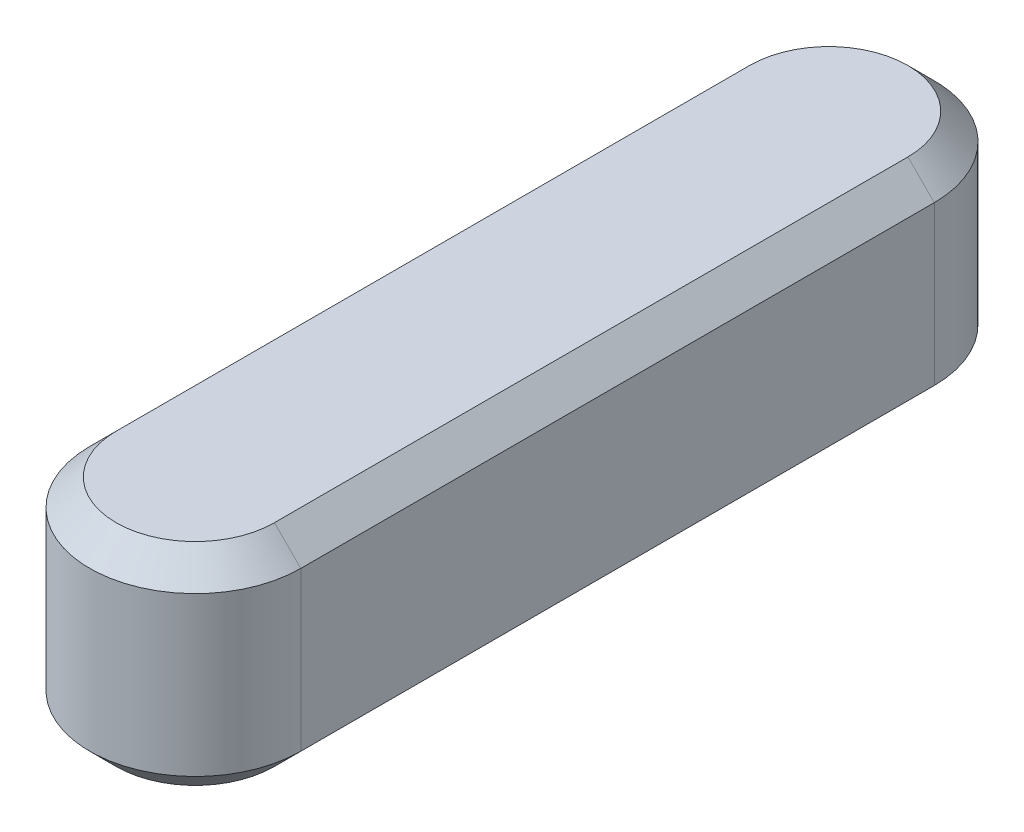
ISO-10303-21;
HEADER;
FILE_DESCRIPTION(('STEP AP214'),'2;1');
FILE_NAME('part.step','',(''),(''),'','','');
FILE_SCHEMA(('AUTOMOTIVE_DESIGN { 1 0 10303 214 1 1 1 1 }'));
ENDSEC;
DATA;
#1=APPLICATION_CONTEXT('core data for automotive mechanical design processes');
#2=APPLICATION_PROTOCOL_DEFINITION('international standard','automotive_design',2000,#1);
#3=PRODUCT_CONTEXT('',#1,'mechanical');
#4=PRODUCT('Part','Part','',(#3));
#5=PRODUCT_RELATED_PRODUCT_CATEGORY('part','',(#4));
#6=PRODUCT_DEFINITION_FORMATION('','',#4);
#7=PRODUCT_DEFINITION_CONTEXT('part definition',#1,'design');
#8=PRODUCT_DEFINITION('design','',#6,#7);
#9=PRODUCT_DEFINITION_SHAPE('','',#8);
#10=(LENGTH_UNIT() NAMED_UNIT(*) SI_UNIT(.MILLI.,.METRE.));
#11=(NAMED_UNIT(*) PLANE_ANGLE_UNIT() SI_UNIT($,.RADIAN.));
#12=(NAMED_UNIT(*) SI_UNIT($,.STERADIAN.) SOLID_ANGLE_UNIT());
#13=UNCERTAINTY_MEASURE_WITH_UNIT(LENGTH_MEASURE(1.E-05),#10,'distance_accuracy_value','');
#14=(GEOMETRIC_REPRESENTATION_CONTEXT(3) GLOBAL_UNCERTAINTY_ASSIGNED_CONTEXT((#13)) GLOBAL_UNIT_ASSIGNED_CONTEXT((#10,
#11,#12)) REPRESENTATION_CONTEXT('',''));
#15=CARTESIAN_POINT('',(0.,0.,0.));
#16=DIRECTION('',(0.,0.,1.));
#17=DIRECTION('',(1.,0.,0.));
#18=AXIS2_PLACEMENT_3D('',#15,#16,#17);
#19=CARTESIAN_POINT('',(0.,1.,-3.));
#20=DIRECTION('',(0.,-1.,0.));
#21=DIRECTION('',(0.,0.,-1.));
#22=AXIS2_PLACEMENT_3D('',#19,#20,#21);
#23=CYLINDRICAL_SURFACE('',#22,1.);
#24=DIRECTION('',(0.,-1.,0.));
#25=VECTOR('',#24,1.);
#26=CARTESIAN_POINT('',(1.00000000000001,1.,-3.));
#27=LINE('',#26,#25);
#28=CARTESIAN_POINT('',(1.00000000000001,0.75,-3.));
#29=VERTEX_POINT('',#28);
#30=CARTESIAN_POINT('',(1.00000000000001,-0.750000000000002,-3.));
#31=VERTEX_POINT('',#30);
#32=EDGE_CURVE('E139',#29,#31,#27,.T.);
#33=ORIENTED_EDGE('',*,*,#32,.T.);
#34=CARTESIAN_POINT('',(0.,-0.750000000000002,-3.));
#35=DIRECTION('',(0.,1.,0.));
#36=DIRECTION('',(0.,0.,1.));
#37=AXIS2_PLACEMENT_3D('',#34,#35,#36);
#38=CIRCLE('',#37,1.);
#39=CARTESIAN_POINT('',(-0.999999999999994,-0.750000000000002,-3.));
#40=VERTEX_POINT('',#39);
#41=EDGE_CURVE('E113',#31,#40,#38,.T.);
#42=ORIENTED_EDGE('',*,*,#41,.T.);
#43=DIRECTION('',(0.,-1.,0.));
#44=VECTOR('',#43,1.);
#45=CARTESIAN_POINT('',(-0.999999999999994,1.,-3.));
#46=LINE('',#45,#44);
#47=CARTESIAN_POINT('',(-0.999999999999994,0.75,-3.));
#48=VERTEX_POINT('',#47);
#49=EDGE_CURVE('E97',#48,#40,#46,.T.);
#50=ORIENTED_EDGE('',*,*,#49,.F.);
#51=CARTESIAN_POINT('',(0.,0.75,-3.));
#52=DIRECTION('',(0.,1.,0.));
#53=DIRECTION('',(0.,0.,1.));
#54=AXIS2_PLACEMENT_3D('',#51,#52,#53);
#55=CIRCLE('',#54,1.);
#56=EDGE_CURVE('E110',#48,#29,#55,.F.);
#57=ORIENTED_EDGE('',*,*,#56,.T.);
#58=EDGE_LOOP('',(#33,#42,#50,#57));
#59=FACE_BOUND('',#58,.T.);
#60=ADVANCED_FACE('F29',(#59),#23,.T.);
#61=CARTESIAN_POINT('',(-0.999999999999994,1.,-3.));
#62=DIRECTION('',(1.,0.,0.));
#63=DIRECTION('',(0.,0.,-1.));
#64=AXIS2_PLACEMENT_3D('',#61,#62,#63);
#65=PLANE('',#64);
#66=ORIENTED_EDGE('',*,*,#49,.T.);
#67=DIRECTION('',(0.,0.,1.));
#68=VECTOR('',#67,1.);
#69=CARTESIAN_POINT('',(-0.999999999999994,-0.750000000000002,-3.));
#70=LINE('',#69,#68);
#71=CARTESIAN_POINT('',(-0.999999999999994,-0.750000000000002,3.));
#72=VERTEX_POINT('',#71);
#73=EDGE_CURVE('E103',#40,#72,#70,.T.);
#74=ORIENTED_EDGE('',*,*,#73,.T.);
#75=DIRECTION('',(0.,-1.,0.));
#76=VECTOR('',#75,1.);
#77=CARTESIAN_POINT('',(-0.999999999999994,1.,3.));
#78=LINE('',#77,#76);
#79=CARTESIAN_POINT('',(-0.999999999999994,0.75,3.));
#80=VERTEX_POINT('',#79);
#81=EDGE_CURVE('E99',#80,#72,#78,.T.);
#82=ORIENTED_EDGE('',*,*,#81,.F.);
#83=DIRECTION('',(0.,0.,-1.));
#84=VECTOR('',#83,1.);
#85=CARTESIAN_POINT('',(-0.999999999999994,0.75,-3.));
#86=LINE('',#85,#84);
#87=EDGE_CURVE('E94',#80,#48,#86,.T.);
#88=ORIENTED_EDGE('',*,*,#87,.T.);
#89=EDGE_LOOP('',(#66,#74,#82,#88));
#90=FACE_BOUND('',#89,.T.);
#91=ADVANCED_FACE('F96',(#90),#65,.F.);
#92=CARTESIAN_POINT('',(0.,1.,3.));
#93=DIRECTION('',(0.,-1.,0.));
#94=DIRECTION('',(0.,0.,-1.));
#95=AXIS2_PLACEMENT_3D('',#92,#93,#94);
#96=CYLINDRICAL_SURFACE('',#95,1.);
#97=ORIENTED_EDGE('',*,*,#81,.T.);
#98=CARTESIAN_POINT('',(0.,-0.750000000000002,3.));
#99=DIRECTION('',(0.,1.,0.));
#100=DIRECTION('',(0.,0.,1.));
#101=AXIS2_PLACEMENT_3D('',#98,#99,#100);
#102=CIRCLE('',#101,1.);
#103=CARTESIAN_POINT('',(1.00000000000001,-0.750000000000002,3.));
#104=VERTEX_POINT('',#103);
#105=EDGE_CURVE('E157',#72,#104,#102,.T.);
#106=ORIENTED_EDGE('',*,*,#105,.T.);
#107=DIRECTION('',(0.,-1.,0.));
#108=VECTOR('',#107,1.);
#109=CARTESIAN_POINT('',(1.00000000000001,1.,3.));
#110=LINE('',#109,#108);
#111=CARTESIAN_POINT('',(1.00000000000001,0.75,3.));
#112=VERTEX_POINT('',#111);
#113=EDGE_CURVE('E141',#112,#104,#110,.T.);
#114=ORIENTED_EDGE('',*,*,#113,.F.);
#115=CARTESIAN_POINT('',(0.,0.75,3.));
#116=DIRECTION('',(0.,1.,0.));
#117=DIRECTION('',(0.,0.,1.));
#118=AXIS2_PLACEMENT_3D('',#115,#116,#117);
#119=CIRCLE('',#118,1.);
#120=EDGE_CURVE('E155',#112,#80,#119,.F.);
#121=ORIENTED_EDGE('',*,*,#120,.T.);
#122=EDGE_LOOP('',(#97,#106,#114,#121));
#123=FACE_BOUND('',#122,.T.);
#124=ADVANCED_FACE('F179',(#123),#96,.T.);
#125=CARTESIAN_POINT('',(1.00000000000001,1.,3.));
#126=DIRECTION('',(-1.,0.,0.));
#127=DIRECTION('',(0.,0.,1.));
#128=AXIS2_PLACEMENT_3D('',#125,#126,#127);
#129=PLANE('',#128);
#130=ORIENTED_EDGE('',*,*,#113,.T.);
#131=DIRECTION('',(0.,0.,-1.));
#132=VECTOR('',#131,1.);
#133=CARTESIAN_POINT('',(1.00000000000001,-0.750000000000002,3.));
#134=LINE('',#133,#132);
#135=EDGE_CURVE('E161',#104,#31,#134,.T.);
#136=ORIENTED_EDGE('',*,*,#135,.T.);
#137=ORIENTED_EDGE('',*,*,#32,.F.);
#138=DIRECTION('',(0.,0.,1.));
#139=VECTOR('',#138,1.);
#140=CARTESIAN_POINT('',(1.00000000000001,0.75,3.));
#141=LINE('',#140,#139);
#142=EDGE_CURVE('E159',#29,#112,#141,.T.);
#143=ORIENTED_EDGE('',*,*,#142,.T.);
#144=EDGE_LOOP('',(#130,#136,#137,#143));
#145=FACE_BOUND('',#144,.T.);
#146=ADVANCED_FACE('F176',(#145),#129,.F.);
#147=CARTESIAN_POINT('',(0.,1.,-3.));
#148=DIRECTION('',(0.,1.,0.));
#149=DIRECTION('',(0.,0.,1.));
#150=AXIS2_PLACEMENT_3D('',#147,#148,#149);
#151=PLANE('',#150);
#152=DIRECTION('',(0.,0.,-1.));
#153=VECTOR('',#152,1.);
#154=CARTESIAN_POINT('',(0.750000000000008,1.,-3.));
#155=LINE('',#154,#153);
#156=CARTESIAN_POINT('',(0.750000000000008,1.,3.));
#157=VERTEX_POINT('',#156);
#158=CARTESIAN_POINT('',(0.750000000000008,1.,-3.));
#159=VERTEX_POINT('',#158);
#160=EDGE_CURVE('E163',#157,#159,#155,.T.);
#161=ORIENTED_EDGE('',*,*,#160,.T.);
#162=CARTESIAN_POINT('',(0.,1.,-3.));
#163=DIRECTION('',(0.,1.,0.));
#164=DIRECTION('',(0.,0.,1.));
#165=AXIS2_PLACEMENT_3D('',#162,#163,#164);
#166=CIRCLE('',#165,0.750000000000002);
#167=CARTESIAN_POINT('',(-0.749999999999995,1.,-3.));
#168=VERTEX_POINT('',#167);
#169=EDGE_CURVE('E11',#159,#168,#166,.T.);
#170=ORIENTED_EDGE('',*,*,#169,.T.);
#171=DIRECTION('',(0.,0.,1.));
#172=VECTOR('',#171,1.);
#173=CARTESIAN_POINT('',(-0.749999999999995,1.,3.));
#174=LINE('',#173,#172);
#175=CARTESIAN_POINT('',(-0.749999999999996,1.,3.));
#176=VERTEX_POINT('',#175);
#177=EDGE_CURVE('E36',#168,#176,#174,.T.);
#178=ORIENTED_EDGE('',*,*,#177,.T.);
#179=CARTESIAN_POINT('',(0.,1.,3.));
#180=DIRECTION('',(0.,1.,0.));
#181=DIRECTION('',(0.,0.,1.));
#182=AXIS2_PLACEMENT_3D('',#179,#180,#181);
#183=CIRCLE('',#182,0.750000000000002);
#184=EDGE_CURVE('E165',#176,#157,#183,.T.);
#185=ORIENTED_EDGE('',*,*,#184,.T.);
#186=EDGE_LOOP('',(#161,#170,#178,#185));
#187=FACE_BOUND('',#186,.T.);
#188=ADVANCED_FACE('F167',(#187),#151,.T.);
#189=CARTESIAN_POINT('',(0.,-1.,-3.));
#190=DIRECTION('',(0.,1.,0.));
#191=DIRECTION('',(0.,0.,1.));
#192=AXIS2_PLACEMENT_3D('',#189,#190,#191);
#193=PLANE('',#192);
#194=DIRECTION('',(0.,0.,-1.));
#195=VECTOR('',#194,1.);
#196=CARTESIAN_POINT('',(-0.749999999999994,-1.,-3.));
#197=LINE('',#196,#195);
#198=CARTESIAN_POINT('',(-0.749999999999994,-1.,3.));
#199=VERTEX_POINT('',#198);
#200=CARTESIAN_POINT('',(-0.749999999999994,-1.,-3.));
#201=VERTEX_POINT('',#200);
#202=EDGE_CURVE('E150',#199,#201,#197,.T.);
#203=ORIENTED_EDGE('',*,*,#202,.T.);
#204=CARTESIAN_POINT('',(0.,-1.,-3.));
#205=DIRECTION('',(0.,1.,0.));
#206=DIRECTION('',(0.,0.,1.));
#207=AXIS2_PLACEMENT_3D('',#204,#205,#206);
#208=CIRCLE('',#207,0.75);
#209=CARTESIAN_POINT('',(0.750000000000006,-1.,-3.));
#210=VERTEX_POINT('',#209);
#211=EDGE_CURVE('E104',#201,#210,#208,.F.);
#212=ORIENTED_EDGE('',*,*,#211,.T.);
#213=DIRECTION('',(0.,0.,1.));
#214=VECTOR('',#213,1.);
#215=CARTESIAN_POINT('',(0.750000000000006,-1.,-3.));
#216=LINE('',#215,#214);
#217=CARTESIAN_POINT('',(0.750000000000006,-1.,3.));
#218=VERTEX_POINT('',#217);
#219=EDGE_CURVE('E146',#210,#218,#216,.T.);
#220=ORIENTED_EDGE('',*,*,#219,.T.);
#221=CARTESIAN_POINT('',(0.,-1.,3.));
#222=DIRECTION('',(0.,1.,0.));
#223=DIRECTION('',(0.,0.,1.));
#224=AXIS2_PLACEMENT_3D('',#221,#222,#223);
#225=CIRCLE('',#224,0.75);
#226=EDGE_CURVE('E148',#218,#199,#225,.F.);
#227=ORIENTED_EDGE('',*,*,#226,.T.);
#228=EDGE_LOOP('',(#203,#212,#220,#227));
#229=FACE_BOUND('',#228,.T.);
#230=ADVANCED_FACE('F193',(#229),#193,.F.);
#231=CARTESIAN_POINT('',(0.,-0.750000000000002,3.));
#232=DIRECTION('',(0.,1.,0.));
#233=DIRECTION('',(0.,0.,1.));
#234=AXIS2_PLACEMENT_3D('',#231,#232,#233);
#235=CONICAL_SURFACE('',#234,1.,0.785398163397452);
#236=DIRECTION('',(-0.70710678118655,0.707106781186545,0.));
#237=VECTOR('',#236,1.);
#238=CARTESIAN_POINT('',(-0.749999999999994,-1.,3.));
#239=LINE('',#238,#237);
#240=EDGE_CURVE('E133',#199,#72,#239,.T.);
#241=ORIENTED_EDGE('',*,*,#240,.F.);
#242=ORIENTED_EDGE('',*,*,#226,.F.);
#243=DIRECTION('',(-0.70710678118655,-0.707106781186545,0.));
#244=VECTOR('',#243,1.);
#245=CARTESIAN_POINT('',(1.00000000000001,-0.750000000000002,3.));
#246=LINE('',#245,#244);
#247=EDGE_CURVE('E136',#104,#218,#246,.T.);
#248=ORIENTED_EDGE('',*,*,#247,.F.);
#249=ORIENTED_EDGE('',*,*,#105,.F.);
#250=EDGE_LOOP('',(#241,#242,#248,#249));
#251=FACE_BOUND('',#250,.T.);
#252=ADVANCED_FACE('F183',(#251),#235,.T.);
#253=CARTESIAN_POINT('',(1.00000000000001,-0.750000000000002,3.));
#254=DIRECTION('',(-0.707106781186545,0.70710678118655,0.));
#255=DIRECTION('',(-0.70710678118655,-0.707106781186545,0.));
#256=AXIS2_PLACEMENT_3D('',#253,#254,#255);
#257=PLANE('',#256);
#258=ORIENTED_EDGE('',*,*,#247,.T.);
#259=ORIENTED_EDGE('',*,*,#219,.F.);
#260=DIRECTION('',(-0.70710678118655,-0.707106781186545,0.));
#261=VECTOR('',#260,1.);
#262=CARTESIAN_POINT('',(1.00000000000001,-0.750000000000002,-3.));
#263=LINE('',#262,#261);
#264=EDGE_CURVE('E131',#31,#210,#263,.T.);
#265=ORIENTED_EDGE('',*,*,#264,.F.);
#266=ORIENTED_EDGE('',*,*,#135,.F.);
#267=EDGE_LOOP('',(#258,#259,#265,#266));
#268=FACE_BOUND('',#267,.T.);
#269=ADVANCED_FACE('F199',(#268),#257,.F.);
#270=CARTESIAN_POINT('',(-0.999999999999994,-0.750000000000002,-3.));
#271=DIRECTION('',(0.707106781186545,0.70710678118655,0.));
#272=DIRECTION('',(-0.70710678118655,0.707106781186545,0.));
#273=AXIS2_PLACEMENT_3D('',#270,#271,#272);
#274=PLANE('',#273);
#275=ORIENTED_EDGE('',*,*,#240,.T.);
#276=ORIENTED_EDGE('',*,*,#73,.F.);
#277=DIRECTION('',(-0.70710678118655,0.707106781186545,0.));
#278=VECTOR('',#277,1.);
#279=CARTESIAN_POINT('',(-0.749999999999994,-1.,-3.));
#280=LINE('',#279,#278);
#281=EDGE_CURVE('E129',#201,#40,#280,.T.);
#282=ORIENTED_EDGE('',*,*,#281,.F.);
#283=ORIENTED_EDGE('',*,*,#202,.F.);
#284=EDGE_LOOP('',(#275,#276,#282,#283));
#285=FACE_BOUND('',#284,.T.);
#286=ADVANCED_FACE('F189',(#285),#274,.F.);
#287=CARTESIAN_POINT('',(0.,-0.750000000000002,-3.));
#288=DIRECTION('',(0.,1.,0.));
#289=DIRECTION('',(0.,0.,1.));
#290=AXIS2_PLACEMENT_3D('',#287,#288,#289);
#291=CONICAL_SURFACE('',#290,1.,0.785398163397452);
#292=ORIENTED_EDGE('',*,*,#264,.T.);
#293=ORIENTED_EDGE('',*,*,#211,.F.);
#294=ORIENTED_EDGE('',*,*,#281,.T.);
#295=ORIENTED_EDGE('',*,*,#41,.F.);
#296=EDGE_LOOP('',(#292,#293,#294,#295));
#297=FACE_BOUND('',#296,.T.);
#298=ADVANCED_FACE('F195',(#297),#291,.T.);
#299=CARTESIAN_POINT('',(0.,1.,3.));
#300=DIRECTION('',(0.,-1.,0.));
#301=DIRECTION('',(0.,0.,-1.));
#302=AXIS2_PLACEMENT_3D('',#299,#300,#301);
#303=CONICAL_SURFACE('',#302,0.750000000000002,0.785398163397445);
#304=DIRECTION('',(0.707106781186545,0.70710678118655,0.));
#305=VECTOR('',#304,1.);
#306=CARTESIAN_POINT('',(-0.999999999999994,0.75,3.));
#307=LINE('',#306,#305);
#308=EDGE_CURVE('E122',#80,#176,#307,.T.);
#309=ORIENTED_EDGE('',*,*,#308,.F.);
#310=ORIENTED_EDGE('',*,*,#120,.F.);
#311=DIRECTION('',(0.707106781186545,-0.70710678118655,0.));
#312=VECTOR('',#311,1.);
#313=CARTESIAN_POINT('',(0.750000000000008,1.,3.));
#314=LINE('',#313,#312);
#315=EDGE_CURVE('E126',#157,#112,#314,.T.);
#316=ORIENTED_EDGE('',*,*,#315,.F.);
#317=ORIENTED_EDGE('',*,*,#184,.F.);
#318=EDGE_LOOP('',(#309,#310,#316,#317));
#319=FACE_BOUND('',#318,.T.);
#320=ADVANCED_FACE('F171',(#319),#303,.T.);
#321=CARTESIAN_POINT('',(0.750000000000008,1.,-3.));
#322=DIRECTION('',(0.70710678118655,0.707106781186545,0.));
#323=DIRECTION('',(-0.707106781186545,0.70710678118655,0.));
#324=AXIS2_PLACEMENT_3D('',#321,#322,#323);
#325=PLANE('',#324);
#326=ORIENTED_EDGE('',*,*,#315,.T.);
#327=ORIENTED_EDGE('',*,*,#142,.F.);
#328=DIRECTION('',(0.707106781186545,-0.70710678118655,0.));
#329=VECTOR('',#328,1.);
#330=CARTESIAN_POINT('',(0.750000000000008,1.,-3.));
#331=LINE('',#330,#329);
#332=EDGE_CURVE('E117',#159,#29,#331,.T.);
#333=ORIENTED_EDGE('',*,*,#332,.F.);
#334=ORIENTED_EDGE('',*,*,#160,.F.);
#335=EDGE_LOOP('',(#326,#327,#333,#334));
#336=FACE_BOUND('',#335,.T.);
#337=ADVANCED_FACE('F173',(#336),#325,.T.);
#338=CARTESIAN_POINT('',(-0.749999999999995,1.,-3.));
#339=DIRECTION('',(-0.70710678118655,0.707106781186545,0.));
#340=DIRECTION('',(-0.707106781186545,-0.70710678118655,0.));
#341=AXIS2_PLACEMENT_3D('',#338,#339,#340);
#342=PLANE('',#341);
#343=ORIENTED_EDGE('',*,*,#308,.T.);
#344=ORIENTED_EDGE('',*,*,#177,.F.);
#345=DIRECTION('',(0.707106781186545,0.70710678118655,0.));
#346=VECTOR('',#345,1.);
#347=CARTESIAN_POINT('',(-0.999999999999994,0.75,-3.));
#348=LINE('',#347,#346);
#349=EDGE_CURVE('E43',#48,#168,#348,.T.);
#350=ORIENTED_EDGE('',*,*,#349,.F.);
#351=ORIENTED_EDGE('',*,*,#87,.F.);
#352=EDGE_LOOP('',(#343,#344,#350,#351));
#353=FACE_BOUND('',#352,.T.);
#354=ADVANCED_FACE('F120',(#353),#342,.T.);
#355=CARTESIAN_POINT('',(0.,1.,-3.));
#356=DIRECTION('',(0.,-1.,0.));
#357=DIRECTION('',(0.,0.,-1.));
#358=AXIS2_PLACEMENT_3D('',#355,#356,#357);
#359=CONICAL_SURFACE('',#358,0.750000000000002,0.785398163397445);
#360=ORIENTED_EDGE('',*,*,#332,.T.);
#361=ORIENTED_EDGE('',*,*,#56,.F.);
#362=ORIENTED_EDGE('',*,*,#349,.T.);
#363=ORIENTED_EDGE('',*,*,#169,.F.);
#364=EDGE_LOOP('',(#360,#361,#362,#363));
#365=FACE_BOUND('',#364,.T.);
#366=ADVANCED_FACE('F115',(#365),#359,.T.);
#367=CLOSED_SHELL('',(#60,#91,#124,#146,#188,#230,#252,#269,#286,#298,#320,#337,#354,#366));
#368=MANIFOLD_SOLID_BREP('B2',#367);
#369=ADVANCED_BREP_SHAPE_REPRESENTATION('',(#18,#368),#14);
#370=SHAPE_DEFINITION_REPRESENTATION(#9,#369);
ENDSEC;
END-ISO-10303-21;
